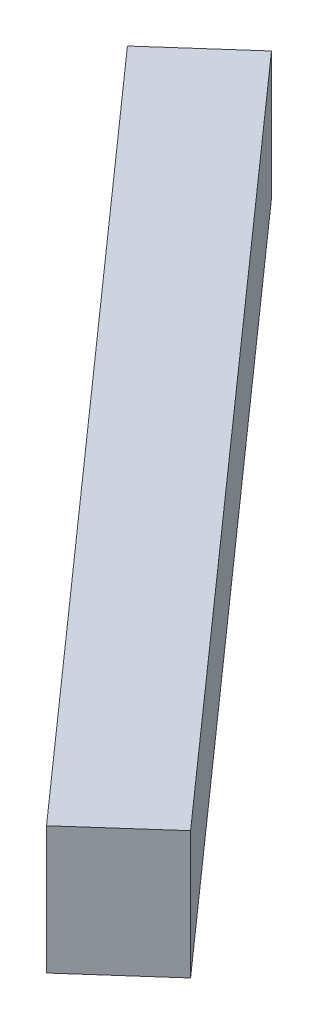
ISO-10303-21;
HEADER;
FILE_DESCRIPTION(('STEP AP214'),'2;1');
FILE_NAME('part.step','',(''),(''),'','','');
FILE_SCHEMA(('AUTOMOTIVE_DESIGN { 1 0 10303 214 1 1 1 1 }'));
ENDSEC;
DATA;
#1=APPLICATION_CONTEXT('core data for automotive mechanical design processes');
#2=APPLICATION_PROTOCOL_DEFINITION('international standard','automotive_design',2000,#1);
#3=PRODUCT_CONTEXT('',#1,'mechanical');
#4=PRODUCT('Part','Part','',(#3));
#5=PRODUCT_RELATED_PRODUCT_CATEGORY('part','',(#4));
#6=PRODUCT_DEFINITION_FORMATION('','',#4);
#7=PRODUCT_DEFINITION_CONTEXT('part definition',#1,'design');
#8=PRODUCT_DEFINITION('design','',#6,#7);
#9=PRODUCT_DEFINITION_SHAPE('','',#8);
#10=(LENGTH_UNIT() NAMED_UNIT(*) SI_UNIT(.MILLI.,.METRE.));
#11=(NAMED_UNIT(*) PLANE_ANGLE_UNIT() SI_UNIT($,.RADIAN.));
#12=(NAMED_UNIT(*) SI_UNIT($,.STERADIAN.) SOLID_ANGLE_UNIT());
#13=UNCERTAINTY_MEASURE_WITH_UNIT(LENGTH_MEASURE(1.E-05),#10,'distance_accuracy_value','');
#14=(GEOMETRIC_REPRESENTATION_CONTEXT(3) GLOBAL_UNCERTAINTY_ASSIGNED_CONTEXT((#13)) GLOBAL_UNIT_ASSIGNED_CONTEXT((#10,
#11,#12)) REPRESENTATION_CONTEXT('',''));
#15=CARTESIAN_POINT('',(0.,0.,0.));
#16=DIRECTION('',(0.,0.,1.));
#17=DIRECTION('',(1.,0.,0.));
#18=AXIS2_PLACEMENT_3D('',#15,#16,#17);
#19=CARTESIAN_POINT('',(-12.0167612926732,7.874,-13.3972832786774));
#20=DIRECTION('',(0.748130177573941,0.,-0.66355198545644));
#21=DIRECTION('',(-0.66355198545644,0.,-0.748130177573941));
#22=AXIS2_PLACEMENT_3D('',#19,#20,#21);
#23=PLANE('',#22);
#24=DIRECTION('',(0.,1.,0.));
#25=VECTOR('',#24,1.);
#26=CARTESIAN_POINT('',(-12.0167612926732,7.874,-13.3972832786774));
#27=LINE('',#26,#25);
#28=CARTESIAN_POINT('',(-12.0167612926732,7.62,-13.3972832786774));
#29=VERTEX_POINT('',#28);
#30=CARTESIAN_POINT('',(-12.0167612926732,7.874,-13.3972832786774));
#31=VERTEX_POINT('',#30);
#32=EDGE_CURVE('E20',#29,#31,#27,.T.);
#33=ORIENTED_EDGE('',*,*,#32,.T.);
#34=DIRECTION('',(-0.663551985456423,0.,-0.748130177573956));
#35=VECTOR('',#34,1.);
#36=CARTESIAN_POINT('',(-12.0167612926732,7.874,-13.3972832786774));
#37=LINE('',#36,#35);
#38=CARTESIAN_POINT('',(-13.2808278249677,7.874,-14.8224712669558));
#39=VERTEX_POINT('',#38);
#40=EDGE_CURVE('E55',#31,#39,#37,.T.);
#41=ORIENTED_EDGE('',*,*,#40,.T.);
#42=DIRECTION('',(0.,1.,0.));
#43=VECTOR('',#42,1.);
#44=CARTESIAN_POINT('',(-13.2808278249677,7.874,-14.8224712669558));
#45=LINE('',#44,#43);
#46=CARTESIAN_POINT('',(-13.2808278249677,7.62,-14.8224712669558));
#47=VERTEX_POINT('',#46);
#48=EDGE_CURVE('E76',#39,#47,#45,.F.);
#49=ORIENTED_EDGE('',*,*,#48,.T.);
#50=DIRECTION('',(-0.663551985456423,0.,-0.748130177573956));
#51=VECTOR('',#50,1.);
#52=CARTESIAN_POINT('',(-12.0167612926732,7.62,-13.3972832786774));
#53=LINE('',#52,#51);
#54=EDGE_CURVE('E58',#29,#47,#53,.T.);
#55=ORIENTED_EDGE('',*,*,#54,.F.);
#56=EDGE_LOOP('',(#33,#41,#49,#55));
#57=FACE_BOUND('',#56,.T.);
#58=ADVANCED_FACE('F17',(#57),#23,.F.);
#59=CARTESIAN_POINT('',(-12.0167612926732,7.874,-13.3972832786774));
#60=DIRECTION('',(-0.663551985456452,0.,-0.748130177573931));
#61=DIRECTION('',(-0.748130177573931,0.,0.663551985456452));
#62=AXIS2_PLACEMENT_3D('',#59,#60,#61);
#63=PLANE('',#62);
#64=DIRECTION('',(0.,1.,0.));
#65=VECTOR('',#64,1.);
#66=CARTESIAN_POINT('',(-11.8647412405902,7.874,-13.5321170421222));
#67=LINE('',#66,#65);
#68=CARTESIAN_POINT('',(-11.8647412405902,7.62,-13.5321170421222));
#69=VERTEX_POINT('',#68);
#70=CARTESIAN_POINT('',(-11.8647412405902,7.874,-13.5321170421222));
#71=VERTEX_POINT('',#70);
#72=EDGE_CURVE('E73',#69,#71,#67,.T.);
#73=ORIENTED_EDGE('',*,*,#72,.T.);
#74=DIRECTION('',(-0.748130177573759,0.,0.663551985456645));
#75=VECTOR('',#74,1.);
#76=CARTESIAN_POINT('',(-11.8647412405902,7.874,-13.5321170421222));
#77=LINE('',#76,#75);
#78=EDGE_CURVE('E63',#71,#31,#77,.T.);
#79=ORIENTED_EDGE('',*,*,#78,.T.);
#80=ORIENTED_EDGE('',*,*,#32,.F.);
#81=DIRECTION('',(-0.748130177573759,0.,0.663551985456645));
#82=VECTOR('',#81,1.);
#83=CARTESIAN_POINT('',(-11.8647412405902,7.62,-13.5321170421222));
#84=LINE('',#83,#82);
#85=EDGE_CURVE('E80',#69,#29,#84,.T.);
#86=ORIENTED_EDGE('',*,*,#85,.F.);
#87=EDGE_LOOP('',(#73,#79,#80,#86));
#88=FACE_BOUND('',#87,.T.);
#89=ADVANCED_FACE('F72',(#88),#63,.F.);
#90=CARTESIAN_POINT('',(-12.0167612926732,7.874,-13.3972832786774));
#91=DIRECTION('',(0.,-1.,0.));
#92=DIRECTION('',(0.,0.,-1.));
#93=AXIS2_PLACEMENT_3D('',#90,#91,#92);
#94=PLANE('',#93);
#95=ORIENTED_EDGE('',*,*,#78,.F.);
#96=DIRECTION('',(0.663551985456438,0.,0.748130177573943));
#97=VECTOR('',#96,1.);
#98=CARTESIAN_POINT('',(-11.8647412405902,7.874,-13.5321170421222));
#99=LINE('',#98,#97);
#100=CARTESIAN_POINT('',(-13.1288077730899,7.874,-14.9573050306319));
#101=VERTEX_POINT('',#100);
#102=EDGE_CURVE('E83',#71,#101,#99,.F.);
#103=ORIENTED_EDGE('',*,*,#102,.T.);
#104=DIRECTION('',(0.748130176563798,0.,-0.663551986595338));
#105=VECTOR('',#104,1.);
#106=CARTESIAN_POINT('',(-13.2808278249677,7.874,-14.8224712669558));
#107=LINE('',#106,#105);
#108=EDGE_CURVE('E69',#101,#39,#107,.F.);
#109=ORIENTED_EDGE('',*,*,#108,.T.);
#110=ORIENTED_EDGE('',*,*,#40,.F.);
#111=EDGE_LOOP('',(#95,#103,#109,#110));
#112=FACE_BOUND('',#111,.T.);
#113=ADVANCED_FACE('F66',(#112),#94,.F.);
#114=CARTESIAN_POINT('',(-13.2808278249677,7.874,-14.8224712669558));
#115=DIRECTION('',(0.663551986595338,0.,0.748130176563798));
#116=DIRECTION('',(0.748130176563798,0.,-0.663551986595338));
#117=AXIS2_PLACEMENT_3D('',#114,#115,#116);
#118=PLANE('',#117);
#119=ORIENTED_EDGE('',*,*,#48,.F.);
#120=ORIENTED_EDGE('',*,*,#108,.F.);
#121=DIRECTION('',(0.,1.,0.));
#122=VECTOR('',#121,1.);
#123=CARTESIAN_POINT('',(-13.1288077730899,7.874,-14.9573050306319));
#124=LINE('',#123,#122);
#125=CARTESIAN_POINT('',(-13.1288077730899,7.62,-14.9573050306319));
#126=VERTEX_POINT('',#125);
#127=EDGE_CURVE('E26',#101,#126,#124,.F.);
#128=ORIENTED_EDGE('',*,*,#127,.T.);
#129=DIRECTION('',(0.748130176564053,0.,-0.663551986595052));
#130=VECTOR('',#129,1.);
#131=CARTESIAN_POINT('',(-13.2808278249677,7.62,-14.8224712669558));
#132=LINE('',#131,#130);
#133=EDGE_CURVE('E34',#47,#126,#132,.T.);
#134=ORIENTED_EDGE('',*,*,#133,.F.);
#135=EDGE_LOOP('',(#119,#120,#128,#134));
#136=FACE_BOUND('',#135,.T.);
#137=ADVANCED_FACE('F88',(#136),#118,.F.);
#138=CARTESIAN_POINT('',(-12.0167612926732,7.62,-13.3972832786774));
#139=DIRECTION('',(0.,-1.,0.));
#140=DIRECTION('',(0.,0.,-1.));
#141=AXIS2_PLACEMENT_3D('',#138,#139,#140);
#142=PLANE('',#141);
#143=DIRECTION('',(0.663551985456438,0.,0.748130177573943));
#144=VECTOR('',#143,1.);
#145=CARTESIAN_POINT('',(-11.8647412405902,7.62,-13.5321170421222));
#146=LINE('',#145,#144);
#147=EDGE_CURVE('E11',#126,#69,#146,.T.);
#148=ORIENTED_EDGE('',*,*,#147,.T.);
#149=ORIENTED_EDGE('',*,*,#85,.T.);
#150=ORIENTED_EDGE('',*,*,#54,.T.);
#151=ORIENTED_EDGE('',*,*,#133,.T.);
#152=EDGE_LOOP('',(#148,#149,#150,#151));
#153=FACE_BOUND('',#152,.T.);
#154=ADVANCED_FACE('F91',(#153),#142,.T.);
#155=CARTESIAN_POINT('',(-11.8647412405902,7.874,-13.5321170421222));
#156=DIRECTION('',(-0.748130177573943,0.,0.663551985456438));
#157=DIRECTION('',(0.663551985456438,0.,0.748130177573943));
#158=AXIS2_PLACEMENT_3D('',#155,#156,#157);
#159=PLANE('',#158);
#160=ORIENTED_EDGE('',*,*,#127,.F.);
#161=ORIENTED_EDGE('',*,*,#102,.F.);
#162=ORIENTED_EDGE('',*,*,#72,.F.);
#163=ORIENTED_EDGE('',*,*,#147,.F.);
#164=EDGE_LOOP('',(#160,#161,#162,#163));
#165=FACE_BOUND('',#164,.T.);
#166=ADVANCED_FACE('F90',(#165),#159,.F.);
#167=CLOSED_SHELL('',(#58,#89,#113,#137,#154,#166));
#168=MANIFOLD_SOLID_BREP('B1',#167);
#169=ADVANCED_BREP_SHAPE_REPRESENTATION('',(#18,#168),#14);
#170=SHAPE_DEFINITION_REPRESENTATION(#9,#169);
ENDSEC;
END-ISO-10303-21;
